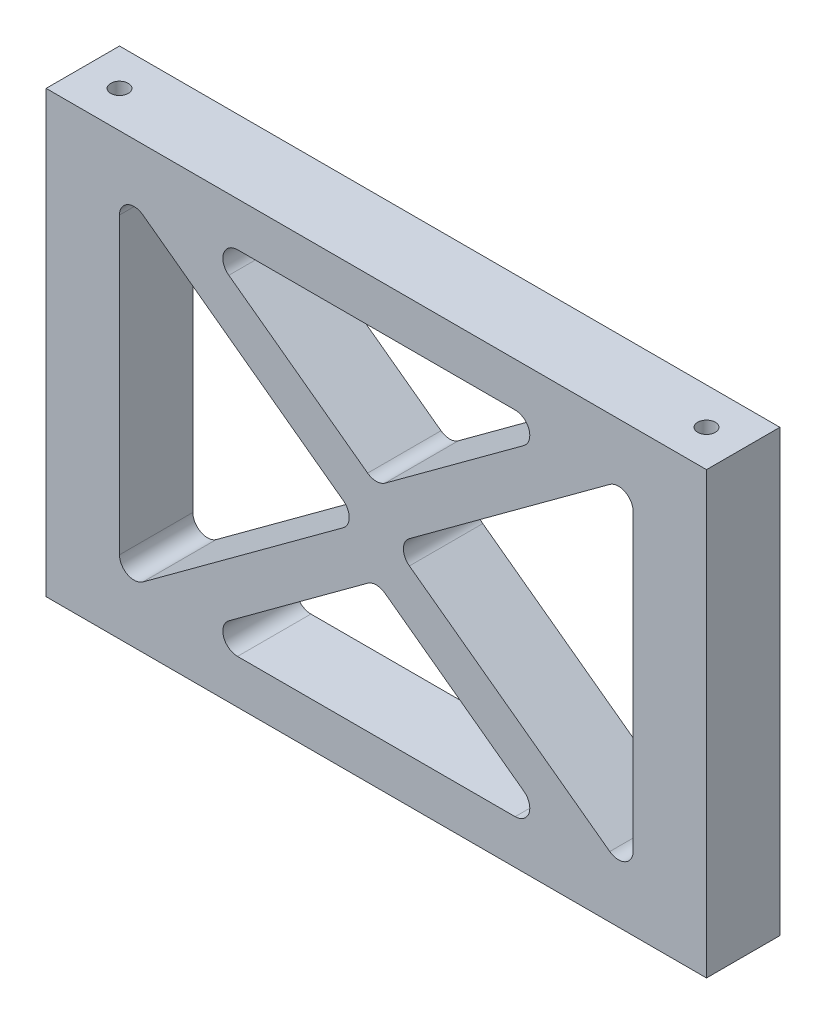
ISO-10303-21;
HEADER;
FILE_DESCRIPTION(('STEP AP214'),'2;1');
FILE_NAME('part.step','',(''),(''),'','','');
FILE_SCHEMA(('AUTOMOTIVE_DESIGN { 1 0 10303 214 1 1 1 1 }'));
ENDSEC;
DATA;
#1=APPLICATION_CONTEXT('core data for automotive mechanical design processes');
#2=APPLICATION_PROTOCOL_DEFINITION('international standard','automotive_design',2000,#1);
#3=PRODUCT_CONTEXT('',#1,'mechanical');
#4=PRODUCT('Part','Part','',(#3));
#5=PRODUCT_RELATED_PRODUCT_CATEGORY('part','',(#4));
#6=PRODUCT_DEFINITION_FORMATION('','',#4);
#7=PRODUCT_DEFINITION_CONTEXT('part definition',#1,'design');
#8=PRODUCT_DEFINITION('design','',#6,#7);
#9=PRODUCT_DEFINITION_SHAPE('','',#8);
#10=(LENGTH_UNIT() NAMED_UNIT(*) SI_UNIT(.MILLI.,.METRE.));
#11=(NAMED_UNIT(*) PLANE_ANGLE_UNIT() SI_UNIT($,.RADIAN.));
#12=(NAMED_UNIT(*) SI_UNIT($,.STERADIAN.) SOLID_ANGLE_UNIT());
#13=UNCERTAINTY_MEASURE_WITH_UNIT(LENGTH_MEASURE(1.E-05),#10,'distance_accuracy_value','');
#14=(GEOMETRIC_REPRESENTATION_CONTEXT(3) GLOBAL_UNCERTAINTY_ASSIGNED_CONTEXT((#13)) GLOBAL_UNIT_ASSIGNED_CONTEXT((#10,
#11,#12)) REPRESENTATION_CONTEXT('',''));
#15=CARTESIAN_POINT('',(0.,0.,0.));
#16=DIRECTION('',(0.,0.,1.));
#17=DIRECTION('',(1.,0.,0.));
#18=AXIS2_PLACEMENT_3D('',#15,#16,#17);
#19=CARTESIAN_POINT('',(0.,0.,10.));
#20=DIRECTION('',(1.,0.,0.));
#21=DIRECTION('',(0.,0.,-1.));
#22=AXIS2_PLACEMENT_3D('',#19,#20,#21);
#23=PLANE('',#22);
#24=DIRECTION('',(0.,-1.,0.));
#25=VECTOR('',#24,1.);
#26=CARTESIAN_POINT('',(0.,0.,0.));
#27=LINE('',#26,#25);
#28=CARTESIAN_POINT('',(0.,60.,0.));
#29=VERTEX_POINT('',#28);
#30=CARTESIAN_POINT('',(0.,0.,0.));
#31=VERTEX_POINT('',#30);
#32=EDGE_CURVE('E483',#29,#31,#27,.T.);
#33=ORIENTED_EDGE('',*,*,#32,.T.);
#34=DIRECTION('',(0.,0.,-1.));
#35=VECTOR('',#34,1.);
#36=CARTESIAN_POINT('',(0.,0.,10.));
#37=LINE('',#36,#35);
#38=CARTESIAN_POINT('',(0.,0.,10.));
#39=VERTEX_POINT('',#38);
#40=EDGE_CURVE('E11',#39,#31,#37,.T.);
#41=ORIENTED_EDGE('',*,*,#40,.F.);
#42=DIRECTION('',(0.,-1.,0.));
#43=VECTOR('',#42,1.);
#44=CARTESIAN_POINT('',(0.,0.,10.));
#45=LINE('',#44,#43);
#46=CARTESIAN_POINT('',(0.,60.,10.));
#47=VERTEX_POINT('',#46);
#48=EDGE_CURVE('E499',#47,#39,#45,.T.);
#49=ORIENTED_EDGE('',*,*,#48,.F.);
#50=DIRECTION('',(0.,0.,-1.));
#51=VECTOR('',#50,1.);
#52=CARTESIAN_POINT('',(0.,60.,10.));
#53=LINE('',#52,#51);
#54=EDGE_CURVE('E513',#47,#29,#53,.T.);
#55=ORIENTED_EDGE('',*,*,#54,.T.);
#56=EDGE_LOOP('',(#33,#41,#49,#55));
#57=FACE_BOUND('',#56,.T.);
#58=ADVANCED_FACE('F39',(#57),#23,.F.);
#59=CARTESIAN_POINT('',(0.,0.,10.));
#60=DIRECTION('',(0.,1.,0.));
#61=DIRECTION('',(0.,0.,1.));
#62=AXIS2_PLACEMENT_3D('',#59,#60,#61);
#63=PLANE('',#62);
#64=CARTESIAN_POINT('',(5.,0.,5.));
#65=DIRECTION('',(0.,1.,0.));
#66=DIRECTION('',(0.,0.,1.));
#67=AXIS2_PLACEMENT_3D('',#64,#65,#66);
#68=CIRCLE('',#67,1.2);
#69=CARTESIAN_POINT('',(5.,0.,6.2));
#70=VERTEX_POINT('',#69);
#71=EDGE_CURVE('E260',#70,#70,#68,.T.);
#72=ORIENTED_EDGE('',*,*,#71,.T.);
#73=EDGE_LOOP('',(#72));
#74=FACE_BOUND('',#73,.T.);
#75=CARTESIAN_POINT('',(85.,0.,5.));
#76=DIRECTION('',(0.,1.,0.));
#77=DIRECTION('',(0.,0.,1.));
#78=AXIS2_PLACEMENT_3D('',#75,#76,#77);
#79=CIRCLE('',#78,1.2);
#80=CARTESIAN_POINT('',(85.,0.,6.2));
#81=VERTEX_POINT('',#80);
#82=EDGE_CURVE('E677',#81,#81,#79,.T.);
#83=ORIENTED_EDGE('',*,*,#82,.T.);
#84=EDGE_LOOP('',(#83));
#85=FACE_BOUND('',#84,.T.);
#86=DIRECTION('',(1.,0.,0.));
#87=VECTOR('',#86,1.);
#88=CARTESIAN_POINT('',(0.,0.,0.));
#89=LINE('',#88,#87);
#90=CARTESIAN_POINT('',(90.,0.,0.));
#91=VERTEX_POINT('',#90);
#92=EDGE_CURVE('E517',#31,#91,#89,.T.);
#93=ORIENTED_EDGE('',*,*,#92,.T.);
#94=DIRECTION('',(0.,0.,-1.));
#95=VECTOR('',#94,1.);
#96=CARTESIAN_POINT('',(90.,0.,10.));
#97=LINE('',#96,#95);
#98=CARTESIAN_POINT('',(90.,0.,10.));
#99=VERTEX_POINT('',#98);
#100=EDGE_CURVE('E47',#99,#91,#97,.T.);
#101=ORIENTED_EDGE('',*,*,#100,.F.);
#102=DIRECTION('',(1.,0.,0.));
#103=VECTOR('',#102,1.);
#104=CARTESIAN_POINT('',(0.,0.,10.));
#105=LINE('',#104,#103);
#106=EDGE_CURVE('E503',#39,#99,#105,.T.);
#107=ORIENTED_EDGE('',*,*,#106,.F.);
#108=ORIENTED_EDGE('',*,*,#40,.T.);
#109=EDGE_LOOP('',(#93,#101,#107,#108));
#110=FACE_BOUND('',#109,.T.);
#111=ADVANCED_FACE('F552',(#74,#85,#110),#63,.F.);
#112=CARTESIAN_POINT('',(90.,0.,10.));
#113=DIRECTION('',(-1.,0.,0.));
#114=DIRECTION('',(0.,0.,1.));
#115=AXIS2_PLACEMENT_3D('',#112,#113,#114);
#116=PLANE('',#115);
#117=DIRECTION('',(0.,1.,0.));
#118=VECTOR('',#117,1.);
#119=CARTESIAN_POINT('',(90.,0.,0.));
#120=LINE('',#119,#118);
#121=CARTESIAN_POINT('',(90.,60.,0.));
#122=VERTEX_POINT('',#121);
#123=EDGE_CURVE('E520',#91,#122,#120,.T.);
#124=ORIENTED_EDGE('',*,*,#123,.T.);
#125=DIRECTION('',(0.,0.,-1.));
#126=VECTOR('',#125,1.);
#127=CARTESIAN_POINT('',(90.,60.,10.));
#128=LINE('',#127,#126);
#129=CARTESIAN_POINT('',(90.,60.,10.));
#130=VERTEX_POINT('',#129);
#131=EDGE_CURVE('E528',#130,#122,#128,.T.);
#132=ORIENTED_EDGE('',*,*,#131,.F.);
#133=DIRECTION('',(0.,1.,0.));
#134=VECTOR('',#133,1.);
#135=CARTESIAN_POINT('',(90.,0.,10.));
#136=LINE('',#135,#134);
#137=EDGE_CURVE('E507',#99,#130,#136,.T.);
#138=ORIENTED_EDGE('',*,*,#137,.F.);
#139=ORIENTED_EDGE('',*,*,#100,.T.);
#140=EDGE_LOOP('',(#124,#132,#138,#139));
#141=FACE_BOUND('',#140,.T.);
#142=ADVANCED_FACE('F537',(#141),#116,.F.);
#143=CARTESIAN_POINT('',(0.,60.,10.));
#144=DIRECTION('',(0.,-1.,0.));
#145=DIRECTION('',(0.,0.,-1.));
#146=AXIS2_PLACEMENT_3D('',#143,#144,#145);
#147=PLANE('',#146);
#148=CARTESIAN_POINT('',(5.,60.,5.));
#149=DIRECTION('',(0.,1.,0.));
#150=DIRECTION('',(0.,0.,1.));
#151=AXIS2_PLACEMENT_3D('',#148,#149,#150);
#152=CIRCLE('',#151,1.2);
#153=CARTESIAN_POINT('',(5.,60.,6.2));
#154=VERTEX_POINT('',#153);
#155=EDGE_CURVE('E674',#154,#154,#152,.T.);
#156=ORIENTED_EDGE('',*,*,#155,.F.);
#157=EDGE_LOOP('',(#156));
#158=FACE_BOUND('',#157,.T.);
#159=CARTESIAN_POINT('',(85.,60.,5.));
#160=DIRECTION('',(0.,1.,0.));
#161=DIRECTION('',(0.,0.,1.));
#162=AXIS2_PLACEMENT_3D('',#159,#160,#161);
#163=CIRCLE('',#162,1.2);
#164=CARTESIAN_POINT('',(85.,60.,6.2));
#165=VERTEX_POINT('',#164);
#166=EDGE_CURVE('E682',#165,#165,#163,.T.);
#167=ORIENTED_EDGE('',*,*,#166,.F.);
#168=EDGE_LOOP('',(#167));
#169=FACE_BOUND('',#168,.T.);
#170=DIRECTION('',(-1.,0.,0.));
#171=VECTOR('',#170,1.);
#172=CARTESIAN_POINT('',(0.,60.,0.));
#173=LINE('',#172,#171);
#174=EDGE_CURVE('E504',#122,#29,#173,.T.);
#175=ORIENTED_EDGE('',*,*,#174,.T.);
#176=ORIENTED_EDGE('',*,*,#54,.F.);
#177=DIRECTION('',(-1.,0.,0.));
#178=VECTOR('',#177,1.);
#179=CARTESIAN_POINT('',(0.,60.,10.));
#180=LINE('',#179,#178);
#181=EDGE_CURVE('E510',#130,#47,#180,.T.);
#182=ORIENTED_EDGE('',*,*,#181,.F.);
#183=ORIENTED_EDGE('',*,*,#131,.T.);
#184=EDGE_LOOP('',(#175,#176,#182,#183));
#185=FACE_BOUND('',#184,.T.);
#186=ADVANCED_FACE('F545',(#158,#169,#185),#147,.F.);
#187=CARTESIAN_POINT('',(0.,0.,10.));
#188=DIRECTION('',(0.,0.,-1.));
#189=DIRECTION('',(-1.,0.,0.));
#190=AXIS2_PLACEMENT_3D('',#187,#188,#189);
#191=PLANE('',#190);
#192=DIRECTION('',(-0.806061266223133,0.591832100426092,0.));
#193=VECTOR('',#192,1.);
#194=CARTESIAN_POINT('',(46.1836642008522,23.5006699268951,10.));
#195=LINE('',#194,#193);
#196=CARTESIAN_POINT('',(65.0995359332397,9.61212253244626,10.));
#197=VERTEX_POINT('',#196);
#198=CARTESIAN_POINT('',(46.1836642008522,23.5006699268951,10.));
#199=VERTEX_POINT('',#198);
#200=EDGE_CURVE('E332',#197,#199,#195,.T.);
#201=ORIENTED_EDGE('',*,*,#200,.F.);
#202=CARTESIAN_POINT('',(63.9158717323875,7.99999999999999,10.));
#203=DIRECTION('',(0.,0.,1.));
#204=DIRECTION('',(-1.,0.,0.));
#205=AXIS2_PLACEMENT_3D('',#202,#203,#204);
#206=CIRCLE('',#205,2.);
#207=CARTESIAN_POINT('',(63.9158717323875,6.,10.));
#208=VERTEX_POINT('',#207);
#209=EDGE_CURVE('E54',#208,#197,#206,.T.);
#210=ORIENTED_EDGE('',*,*,#209,.F.);
#211=DIRECTION('',(1.,0.,0.));
#212=VECTOR('',#211,1.);
#213=CARTESIAN_POINT('',(26.0841282676125,6.,10.));
#214=LINE('',#213,#212);
#215=CARTESIAN_POINT('',(26.0841282676125,5.99999999999999,10.));
#216=VERTEX_POINT('',#215);
#217=EDGE_CURVE('E309',#216,#208,#214,.T.);
#218=ORIENTED_EDGE('',*,*,#217,.F.);
#219=CARTESIAN_POINT('',(26.0841282676125,7.99999999999999,10.));
#220=DIRECTION('',(0.,0.,1.));
#221=DIRECTION('',(-1.,0.,0.));
#222=AXIS2_PLACEMENT_3D('',#219,#220,#221);
#223=CIRCLE('',#222,2.);
#224=CARTESIAN_POINT('',(24.9004640667603,9.61212253244626,10.));
#225=VERTEX_POINT('',#224);
#226=EDGE_CURVE('E345',#225,#216,#223,.T.);
#227=ORIENTED_EDGE('',*,*,#226,.F.);
#228=DIRECTION('',(-0.806061266223133,-0.591832100426092,0.));
#229=VECTOR('',#228,1.);
#230=CARTESIAN_POINT('',(43.8163357991478,23.5006699268951,10.));
#231=LINE('',#230,#229);
#232=CARTESIAN_POINT('',(43.8163357991478,23.5006699268951,10.));
#233=VERTEX_POINT('',#232);
#234=EDGE_CURVE('E341',#233,#225,#231,.T.);
#235=ORIENTED_EDGE('',*,*,#234,.F.);
#236=CARTESIAN_POINT('',(45.,21.8885473944488,10.));
#237=DIRECTION('',(0.,0.,1.));
#238=DIRECTION('',(-1.,0.,0.));
#239=AXIS2_PLACEMENT_3D('',#236,#237,#238);
#240=CIRCLE('',#239,2.);
#241=EDGE_CURVE('E337',#199,#233,#240,.T.);
#242=ORIENTED_EDGE('',*,*,#241,.F.);
#243=EDGE_LOOP('',(#201,#210,#218,#227,#235,#242));
#244=FACE_BOUND('',#243,.T.);
#245=DIRECTION('',(-1.,0.,0.));
#246=VECTOR('',#245,1.);
#247=CARTESIAN_POINT('',(26.0841282676125,54.,10.));
#248=LINE('',#247,#246);
#249=CARTESIAN_POINT('',(63.9158717323875,54.,10.));
#250=VERTEX_POINT('',#249);
#251=CARTESIAN_POINT('',(26.0841282676125,54.,10.));
#252=VERTEX_POINT('',#251);
#253=EDGE_CURVE('E398',#250,#252,#248,.T.);
#254=ORIENTED_EDGE('',*,*,#253,.F.);
#255=CARTESIAN_POINT('',(63.9158717323875,52.,10.));
#256=DIRECTION('',(0.,0.,1.));
#257=DIRECTION('',(1.,0.,0.));
#258=AXIS2_PLACEMENT_3D('',#255,#256,#257);
#259=CIRCLE('',#258,2.);
#260=CARTESIAN_POINT('',(65.0995359332397,50.3878774675537,10.));
#261=VERTEX_POINT('',#260);
#262=EDGE_CURVE('E62',#261,#250,#259,.T.);
#263=ORIENTED_EDGE('',*,*,#262,.F.);
#264=DIRECTION('',(0.806061266223133,0.591832100426092,0.));
#265=VECTOR('',#264,1.);
#266=CARTESIAN_POINT('',(46.1836642008522,36.4993300731049,10.));
#267=LINE('',#266,#265);
#268=CARTESIAN_POINT('',(46.1836642008522,36.4993300731049,10.));
#269=VERTEX_POINT('',#268);
#270=EDGE_CURVE('E375',#269,#261,#267,.T.);
#271=ORIENTED_EDGE('',*,*,#270,.F.);
#272=CARTESIAN_POINT('',(45.,38.1114526055512,10.));
#273=DIRECTION('',(0.,0.,1.));
#274=DIRECTION('',(1.,0.,0.));
#275=AXIS2_PLACEMENT_3D('',#272,#273,#274);
#276=CIRCLE('',#275,2.);
#277=CARTESIAN_POINT('',(43.8163357991478,36.4993300731049,10.));
#278=VERTEX_POINT('',#277);
#279=EDGE_CURVE('E410',#278,#269,#276,.T.);
#280=ORIENTED_EDGE('',*,*,#279,.F.);
#281=DIRECTION('',(0.806061266223133,-0.591832100426092,0.));
#282=VECTOR('',#281,1.);
#283=CARTESIAN_POINT('',(43.8163357991478,36.4993300731049,10.));
#284=LINE('',#283,#282);
#285=CARTESIAN_POINT('',(24.9004640667603,50.3878774675537,10.));
#286=VERTEX_POINT('',#285);
#287=EDGE_CURVE('E406',#286,#278,#284,.T.);
#288=ORIENTED_EDGE('',*,*,#287,.F.);
#289=CARTESIAN_POINT('',(26.0841282676125,52.,10.));
#290=DIRECTION('',(0.,0.,1.));
#291=DIRECTION('',(-1.,0.,0.));
#292=AXIS2_PLACEMENT_3D('',#289,#290,#291);
#293=CIRCLE('',#292,2.);
#294=EDGE_CURVE('E402',#252,#286,#293,.T.);
#295=ORIENTED_EDGE('',*,*,#294,.F.);
#296=EDGE_LOOP('',(#254,#263,#271,#280,#288,#295));
#297=FACE_BOUND('',#296,.T.);
#298=DIRECTION('',(-0.80606126622313,0.591832100426096,0.));
#299=VECTOR('',#298,1.);
#300=CARTESIAN_POINT('',(13.1836642008522,51.6624671721663,10.));
#301=LINE('',#300,#299);
#302=CARTESIAN_POINT('',(40.4917574537647,31.6121225324463,10.));
#303=VERTEX_POINT('',#302);
#304=CARTESIAN_POINT('',(13.1836642008522,51.6624671721663,10.));
#305=VERTEX_POINT('',#304);
#306=EDGE_CURVE('E276',#303,#305,#301,.T.);
#307=ORIENTED_EDGE('',*,*,#306,.F.);
#308=CARTESIAN_POINT('',(39.3080932529125,30.,10.));
#309=DIRECTION('',(0.,0.,1.));
#310=DIRECTION('',(-1.,0.,0.));
#311=AXIS2_PLACEMENT_3D('',#308,#309,#310);
#312=CIRCLE('',#311,2.);
#313=CARTESIAN_POINT('',(40.4917574537647,28.3878774675537,10.));
#314=VERTEX_POINT('',#313);
#315=EDGE_CURVE('E231',#314,#303,#312,.T.);
#316=ORIENTED_EDGE('',*,*,#315,.F.);
#317=DIRECTION('',(0.80606126622313,0.591832100426096,0.));
#318=VECTOR('',#317,1.);
#319=CARTESIAN_POINT('',(13.1836642008522,8.33753282783365,10.));
#320=LINE('',#319,#318);
#321=CARTESIAN_POINT('',(13.1836642008522,8.33753282783364,10.));
#322=VERTEX_POINT('',#321);
#323=EDGE_CURVE('E253',#322,#314,#320,.T.);
#324=ORIENTED_EDGE('',*,*,#323,.F.);
#325=CARTESIAN_POINT('',(12.,9.94965536027989,10.));
#326=DIRECTION('',(0.,0.,1.));
#327=DIRECTION('',(-1.,0.,0.));
#328=AXIS2_PLACEMENT_3D('',#325,#326,#327);
#329=CIRCLE('',#328,1.99999999999999);
#330=CARTESIAN_POINT('',(10.,9.94965536027989,10.));
#331=VERTEX_POINT('',#330);
#332=EDGE_CURVE('E257',#331,#322,#329,.T.);
#333=ORIENTED_EDGE('',*,*,#332,.F.);
#334=DIRECTION('',(0.,-1.,0.));
#335=VECTOR('',#334,1.);
#336=CARTESIAN_POINT('',(10.,50.0503446397201,10.));
#337=LINE('',#336,#335);
#338=CARTESIAN_POINT('',(10.,50.0503446397201,10.));
#339=VERTEX_POINT('',#338);
#340=EDGE_CURVE('E283',#339,#331,#337,.T.);
#341=ORIENTED_EDGE('',*,*,#340,.F.);
#342=CARTESIAN_POINT('',(12.,50.0503446397201,10.));
#343=DIRECTION('',(0.,0.,1.));
#344=DIRECTION('',(-1.,0.,0.));
#345=AXIS2_PLACEMENT_3D('',#342,#343,#344);
#346=CIRCLE('',#345,1.99999999999999);
#347=EDGE_CURVE('E279',#305,#339,#346,.T.);
#348=ORIENTED_EDGE('',*,*,#347,.F.);
#349=EDGE_LOOP('',(#307,#316,#324,#333,#341,#348));
#350=FACE_BOUND('',#349,.T.);
#351=DIRECTION('',(0.,1.,0.));
#352=VECTOR('',#351,1.);
#353=CARTESIAN_POINT('',(80.,50.0503446397201,10.));
#354=LINE('',#353,#352);
#355=CARTESIAN_POINT('',(80.,9.94965536027992,10.));
#356=VERTEX_POINT('',#355);
#357=CARTESIAN_POINT('',(80.,50.0503446397201,10.));
#358=VERTEX_POINT('',#357);
#359=EDGE_CURVE('E461',#356,#358,#354,.T.);
#360=ORIENTED_EDGE('',*,*,#359,.F.);
#361=CARTESIAN_POINT('',(78.,9.94965536027992,10.));
#362=DIRECTION('',(0.,0.,1.));
#363=DIRECTION('',(-1.,0.,0.));
#364=AXIS2_PLACEMENT_3D('',#361,#362,#363);
#365=CIRCLE('',#364,2.00000000000001);
#366=CARTESIAN_POINT('',(76.8163357991478,8.33753282783363,10.));
#367=VERTEX_POINT('',#366);
#368=EDGE_CURVE('E355',#367,#356,#365,.T.);
#369=ORIENTED_EDGE('',*,*,#368,.F.);
#370=DIRECTION('',(0.80606126622313,-0.591832100426096,0.));
#371=VECTOR('',#370,1.);
#372=CARTESIAN_POINT('',(76.8163357991478,8.33753282783363,10.));
#373=LINE('',#372,#371);
#374=CARTESIAN_POINT('',(49.5082425462353,28.3878774675537,10.));
#375=VERTEX_POINT('',#374);
#376=EDGE_CURVE('E438',#375,#367,#373,.T.);
#377=ORIENTED_EDGE('',*,*,#376,.F.);
#378=CARTESIAN_POINT('',(50.6919067470874,30.,10.));
#379=DIRECTION('',(0.,0.,1.));
#380=DIRECTION('',(-1.,0.,0.));
#381=AXIS2_PLACEMENT_3D('',#378,#379,#380);
#382=CIRCLE('',#381,2.);
#383=CARTESIAN_POINT('',(49.5082425462353,31.6121225324463,10.));
#384=VERTEX_POINT('',#383);
#385=EDGE_CURVE('E473',#384,#375,#382,.T.);
#386=ORIENTED_EDGE('',*,*,#385,.F.);
#387=DIRECTION('',(-0.80606126622313,-0.591832100426096,0.));
#388=VECTOR('',#387,1.);
#389=CARTESIAN_POINT('',(76.8163357991478,51.6624671721664,10.));
#390=LINE('',#389,#388);
#391=CARTESIAN_POINT('',(76.8163357991478,51.6624671721663,10.));
#392=VERTEX_POINT('',#391);
#393=EDGE_CURVE('E469',#392,#384,#390,.T.);
#394=ORIENTED_EDGE('',*,*,#393,.F.);
#395=CARTESIAN_POINT('',(78.,50.0503446397201,10.));
#396=DIRECTION('',(0.,0.,1.));
#397=DIRECTION('',(1.,0.,0.));
#398=AXIS2_PLACEMENT_3D('',#395,#396,#397);
#399=CIRCLE('',#398,2.00000000000001);
#400=EDGE_CURVE('E465',#358,#392,#399,.T.);
#401=ORIENTED_EDGE('',*,*,#400,.F.);
#402=EDGE_LOOP('',(#360,#369,#377,#386,#394,#401));
#403=FACE_BOUND('',#402,.T.);
#404=ORIENTED_EDGE('',*,*,#48,.T.);
#405=ORIENTED_EDGE('',*,*,#106,.T.);
#406=ORIENTED_EDGE('',*,*,#137,.T.);
#407=ORIENTED_EDGE('',*,*,#181,.T.);
#408=EDGE_LOOP('',(#404,#405,#406,#407));
#409=FACE_BOUND('',#408,.T.);
#410=ADVANCED_FACE('F551',(#244,#297,#350,#403,#409),#191,.F.);
#411=CARTESIAN_POINT('',(0.,0.,0.));
#412=DIRECTION('',(0.,0.,-1.));
#413=DIRECTION('',(-1.,0.,0.));
#414=AXIS2_PLACEMENT_3D('',#411,#412,#413);
#415=PLANE('',#414);
#416=CARTESIAN_POINT('',(63.9158717323875,7.99999999999999,0.));
#417=DIRECTION('',(0.,0.,1.));
#418=DIRECTION('',(-1.,0.,0.));
#419=AXIS2_PLACEMENT_3D('',#416,#417,#418);
#420=CIRCLE('',#419,2.);
#421=CARTESIAN_POINT('',(63.9158717323875,6.,0.));
#422=VERTEX_POINT('',#421);
#423=CARTESIAN_POINT('',(65.0995359332397,9.61212253244626,0.));
#424=VERTEX_POINT('',#423);
#425=EDGE_CURVE('E304',#422,#424,#420,.T.);
#426=ORIENTED_EDGE('',*,*,#425,.T.);
#427=DIRECTION('',(-0.806061266223133,0.591832100426092,0.));
#428=VECTOR('',#427,1.);
#429=CARTESIAN_POINT('',(46.1836642008522,23.5006699268951,0.));
#430=LINE('',#429,#428);
#431=CARTESIAN_POINT('',(46.1836642008522,23.5006699268951,0.));
#432=VERTEX_POINT('',#431);
#433=EDGE_CURVE('E308',#424,#432,#430,.T.);
#434=ORIENTED_EDGE('',*,*,#433,.T.);
#435=CARTESIAN_POINT('',(45.,21.8885473944488,0.));
#436=DIRECTION('',(0.,0.,1.));
#437=DIRECTION('',(-1.,0.,0.));
#438=AXIS2_PLACEMENT_3D('',#435,#436,#437);
#439=CIRCLE('',#438,2.);
#440=CARTESIAN_POINT('',(43.8163357991478,23.5006699268951,0.));
#441=VERTEX_POINT('',#440);
#442=EDGE_CURVE('E313',#432,#441,#439,.T.);
#443=ORIENTED_EDGE('',*,*,#442,.T.);
#444=DIRECTION('',(-0.806061266223133,-0.591832100426092,0.));
#445=VECTOR('',#444,1.);
#446=CARTESIAN_POINT('',(43.8163357991478,23.5006699268951,0.));
#447=LINE('',#446,#445);
#448=CARTESIAN_POINT('',(24.9004640667603,9.61212253244626,0.));
#449=VERTEX_POINT('',#448);
#450=EDGE_CURVE('E317',#441,#449,#447,.T.);
#451=ORIENTED_EDGE('',*,*,#450,.T.);
#452=CARTESIAN_POINT('',(26.0841282676125,7.99999999999999,0.));
#453=DIRECTION('',(0.,0.,1.));
#454=DIRECTION('',(-1.,0.,0.));
#455=AXIS2_PLACEMENT_3D('',#452,#453,#454);
#456=CIRCLE('',#455,2.);
#457=CARTESIAN_POINT('',(26.0841282676125,5.99999999999999,0.));
#458=VERTEX_POINT('',#457);
#459=EDGE_CURVE('E321',#449,#458,#456,.T.);
#460=ORIENTED_EDGE('',*,*,#459,.T.);
#461=DIRECTION('',(1.,0.,0.));
#462=VECTOR('',#461,1.);
#463=CARTESIAN_POINT('',(26.0841282676125,6.,0.));
#464=LINE('',#463,#462);
#465=EDGE_CURVE('E325',#458,#422,#464,.T.);
#466=ORIENTED_EDGE('',*,*,#465,.T.);
#467=EDGE_LOOP('',(#426,#434,#443,#451,#460,#466));
#468=FACE_BOUND('',#467,.T.);
#469=CARTESIAN_POINT('',(63.9158717323875,52.,0.));
#470=DIRECTION('',(0.,0.,1.));
#471=DIRECTION('',(1.,0.,0.));
#472=AXIS2_PLACEMENT_3D('',#469,#470,#471);
#473=CIRCLE('',#472,2.);
#474=CARTESIAN_POINT('',(65.0995359332397,50.3878774675537,0.));
#475=VERTEX_POINT('',#474);
#476=CARTESIAN_POINT('',(63.9158717323875,54.,0.));
#477=VERTEX_POINT('',#476);
#478=EDGE_CURVE('E370',#475,#477,#473,.T.);
#479=ORIENTED_EDGE('',*,*,#478,.T.);
#480=DIRECTION('',(-1.,0.,0.));
#481=VECTOR('',#480,1.);
#482=CARTESIAN_POINT('',(26.0841282676125,54.,0.));
#483=LINE('',#482,#481);
#484=CARTESIAN_POINT('',(26.0841282676125,54.,0.));
#485=VERTEX_POINT('',#484);
#486=EDGE_CURVE('E374',#477,#485,#483,.T.);
#487=ORIENTED_EDGE('',*,*,#486,.T.);
#488=CARTESIAN_POINT('',(26.0841282676125,52.,0.));
#489=DIRECTION('',(0.,0.,1.));
#490=DIRECTION('',(-1.,0.,0.));
#491=AXIS2_PLACEMENT_3D('',#488,#489,#490);
#492=CIRCLE('',#491,2.);
#493=CARTESIAN_POINT('',(24.9004640667603,50.3878774675537,0.));
#494=VERTEX_POINT('',#493);
#495=EDGE_CURVE('E379',#485,#494,#492,.T.);
#496=ORIENTED_EDGE('',*,*,#495,.T.);
#497=DIRECTION('',(0.806061266223133,-0.591832100426092,0.));
#498=VECTOR('',#497,1.);
#499=CARTESIAN_POINT('',(43.8163357991478,36.4993300731049,0.));
#500=LINE('',#499,#498);
#501=CARTESIAN_POINT('',(43.8163357991478,36.4993300731049,0.));
#502=VERTEX_POINT('',#501);
#503=EDGE_CURVE('E383',#494,#502,#500,.T.);
#504=ORIENTED_EDGE('',*,*,#503,.T.);
#505=CARTESIAN_POINT('',(45.,38.1114526055512,0.));
#506=DIRECTION('',(0.,0.,1.));
#507=DIRECTION('',(1.,0.,0.));
#508=AXIS2_PLACEMENT_3D('',#505,#506,#507);
#509=CIRCLE('',#508,2.);
#510=CARTESIAN_POINT('',(46.1836642008522,36.4993300731049,0.));
#511=VERTEX_POINT('',#510);
#512=EDGE_CURVE('E387',#502,#511,#509,.T.);
#513=ORIENTED_EDGE('',*,*,#512,.T.);
#514=DIRECTION('',(0.806061266223133,0.591832100426092,0.));
#515=VECTOR('',#514,1.);
#516=CARTESIAN_POINT('',(46.1836642008522,36.4993300731049,0.));
#517=LINE('',#516,#515);
#518=EDGE_CURVE('E391',#511,#475,#517,.T.);
#519=ORIENTED_EDGE('',*,*,#518,.T.);
#520=EDGE_LOOP('',(#479,#487,#496,#504,#513,#519));
#521=FACE_BOUND('',#520,.T.);
#522=CARTESIAN_POINT('',(39.3080932529125,30.,0.));
#523=DIRECTION('',(0.,0.,1.));
#524=DIRECTION('',(-1.,0.,0.));
#525=AXIS2_PLACEMENT_3D('',#522,#523,#524);
#526=CIRCLE('',#525,2.);
#527=CARTESIAN_POINT('',(40.4917574537647,28.3878774675537,0.));
#528=VERTEX_POINT('',#527);
#529=CARTESIAN_POINT('',(40.4917574537647,31.6121225324463,0.));
#530=VERTEX_POINT('',#529);
#531=EDGE_CURVE('E228',#528,#530,#526,.T.);
#532=ORIENTED_EDGE('',*,*,#531,.T.);
#533=DIRECTION('',(-0.80606126622313,0.591832100426096,0.));
#534=VECTOR('',#533,1.);
#535=CARTESIAN_POINT('',(13.1836642008522,51.6624671721663,0.));
#536=LINE('',#535,#534);
#537=CARTESIAN_POINT('',(13.1836642008522,51.6624671721663,0.));
#538=VERTEX_POINT('',#537);
#539=EDGE_CURVE('E241',#530,#538,#536,.T.);
#540=ORIENTED_EDGE('',*,*,#539,.T.);
#541=CARTESIAN_POINT('',(12.,50.0503446397201,0.));
#542=DIRECTION('',(0.,0.,1.));
#543=DIRECTION('',(-1.,0.,0.));
#544=AXIS2_PLACEMENT_3D('',#541,#542,#543);
#545=CIRCLE('',#544,1.99999999999999);
#546=CARTESIAN_POINT('',(10.,50.0503446397201,0.));
#547=VERTEX_POINT('',#546);
#548=EDGE_CURVE('E246',#538,#547,#545,.T.);
#549=ORIENTED_EDGE('',*,*,#548,.T.);
#550=DIRECTION('',(0.,-1.,0.));
#551=VECTOR('',#550,1.);
#552=CARTESIAN_POINT('',(10.,50.0503446397201,0.));
#553=LINE('',#552,#551);
#554=CARTESIAN_POINT('',(10.,9.94965536027989,0.));
#555=VERTEX_POINT('',#554);
#556=EDGE_CURVE('E265',#547,#555,#553,.T.);
#557=ORIENTED_EDGE('',*,*,#556,.T.);
#558=CARTESIAN_POINT('',(12.,9.94965536027989,0.));
#559=DIRECTION('',(0.,0.,1.));
#560=DIRECTION('',(-1.,0.,0.));
#561=AXIS2_PLACEMENT_3D('',#558,#559,#560);
#562=CIRCLE('',#561,1.99999999999999);
#563=CARTESIAN_POINT('',(13.1836642008522,8.33753282783364,0.));
#564=VERTEX_POINT('',#563);
#565=EDGE_CURVE('E269',#555,#564,#562,.T.);
#566=ORIENTED_EDGE('',*,*,#565,.T.);
#567=DIRECTION('',(0.80606126622313,0.591832100426096,0.));
#568=VECTOR('',#567,1.);
#569=CARTESIAN_POINT('',(13.1836642008522,8.33753282783365,0.));
#570=LINE('',#569,#568);
#571=EDGE_CURVE('E237',#564,#528,#570,.T.);
#572=ORIENTED_EDGE('',*,*,#571,.T.);
#573=EDGE_LOOP('',(#532,#540,#549,#557,#566,#572));
#574=FACE_BOUND('',#573,.T.);
#575=CARTESIAN_POINT('',(78.,9.94965536027992,0.));
#576=DIRECTION('',(0.,0.,1.));
#577=DIRECTION('',(-1.,0.,0.));
#578=AXIS2_PLACEMENT_3D('',#575,#576,#577);
#579=CIRCLE('',#578,2.00000000000001);
#580=CARTESIAN_POINT('',(76.8163357991478,8.33753282783363,0.));
#581=VERTEX_POINT('',#580);
#582=CARTESIAN_POINT('',(80.,9.94965536027992,0.));
#583=VERTEX_POINT('',#582);
#584=EDGE_CURVE('E433',#581,#583,#579,.T.);
#585=ORIENTED_EDGE('',*,*,#584,.T.);
#586=DIRECTION('',(0.,1.,0.));
#587=VECTOR('',#586,1.);
#588=CARTESIAN_POINT('',(80.,50.0503446397201,0.));
#589=LINE('',#588,#587);
#590=CARTESIAN_POINT('',(80.,50.0503446397201,0.));
#591=VERTEX_POINT('',#590);
#592=EDGE_CURVE('E437',#583,#591,#589,.T.);
#593=ORIENTED_EDGE('',*,*,#592,.T.);
#594=CARTESIAN_POINT('',(78.,50.0503446397201,0.));
#595=DIRECTION('',(0.,0.,1.));
#596=DIRECTION('',(1.,0.,0.));
#597=AXIS2_PLACEMENT_3D('',#594,#595,#596);
#598=CIRCLE('',#597,2.00000000000001);
#599=CARTESIAN_POINT('',(76.8163357991478,51.6624671721663,0.));
#600=VERTEX_POINT('',#599);
#601=EDGE_CURVE('E442',#591,#600,#598,.T.);
#602=ORIENTED_EDGE('',*,*,#601,.T.);
#603=DIRECTION('',(-0.80606126622313,-0.591832100426096,0.));
#604=VECTOR('',#603,1.);
#605=CARTESIAN_POINT('',(76.8163357991478,51.6624671721664,0.));
#606=LINE('',#605,#604);
#607=CARTESIAN_POINT('',(49.5082425462353,31.6121225324463,0.));
#608=VERTEX_POINT('',#607);
#609=EDGE_CURVE('E446',#600,#608,#606,.T.);
#610=ORIENTED_EDGE('',*,*,#609,.T.);
#611=CARTESIAN_POINT('',(50.6919067470874,30.,0.));
#612=DIRECTION('',(0.,0.,1.));
#613=DIRECTION('',(-1.,0.,0.));
#614=AXIS2_PLACEMENT_3D('',#611,#612,#613);
#615=CIRCLE('',#614,2.);
#616=CARTESIAN_POINT('',(49.5082425462353,28.3878774675537,0.));
#617=VERTEX_POINT('',#616);
#618=EDGE_CURVE('E450',#608,#617,#615,.T.);
#619=ORIENTED_EDGE('',*,*,#618,.T.);
#620=DIRECTION('',(0.80606126622313,-0.591832100426096,0.));
#621=VECTOR('',#620,1.);
#622=CARTESIAN_POINT('',(76.8163357991478,8.33753282783363,0.));
#623=LINE('',#622,#621);
#624=EDGE_CURVE('E454',#617,#581,#623,.T.);
#625=ORIENTED_EDGE('',*,*,#624,.T.);
#626=EDGE_LOOP('',(#585,#593,#602,#610,#619,#625));
#627=FACE_BOUND('',#626,.T.);
#628=ORIENTED_EDGE('',*,*,#32,.F.);
#629=ORIENTED_EDGE('',*,*,#174,.F.);
#630=ORIENTED_EDGE('',*,*,#123,.F.);
#631=ORIENTED_EDGE('',*,*,#92,.F.);
#632=EDGE_LOOP('',(#628,#629,#630,#631));
#633=FACE_BOUND('',#632,.T.);
#634=ADVANCED_FACE('F248',(#468,#521,#574,#627,#633),#415,.T.);
#635=CARTESIAN_POINT('',(78.,9.94965536027992,0.));
#636=DIRECTION('',(0.,0.,1.));
#637=DIRECTION('',(1.,0.,0.));
#638=AXIS2_PLACEMENT_3D('',#635,#636,#637);
#639=CYLINDRICAL_SURFACE('',#638,2.00000000000001);
#640=ORIENTED_EDGE('',*,*,#368,.T.);
#641=DIRECTION('',(0.,0.,1.));
#642=VECTOR('',#641,1.);
#643=CARTESIAN_POINT('',(80.,9.94965536027992,0.));
#644=LINE('',#643,#642);
#645=EDGE_CURVE('E458',#583,#356,#644,.T.);
#646=ORIENTED_EDGE('',*,*,#645,.F.);
#647=ORIENTED_EDGE('',*,*,#584,.F.);
#648=DIRECTION('',(0.,0.,1.));
#649=VECTOR('',#648,1.);
#650=CARTESIAN_POINT('',(76.8163357991478,8.33753282783363,0.));
#651=LINE('',#650,#649);
#652=EDGE_CURVE('E480',#581,#367,#651,.T.);
#653=ORIENTED_EDGE('',*,*,#652,.T.);
#654=EDGE_LOOP('',(#640,#646,#647,#653));
#655=FACE_BOUND('',#654,.T.);
#656=ADVANCED_FACE('F568',(#655),#639,.F.);
#657=CARTESIAN_POINT('',(76.8163357991478,8.33753282783363,0.));
#658=DIRECTION('',(-0.591832100426096,-0.80606126622313,0.));
#659=DIRECTION('',(0.80606126622313,-0.591832100426096,0.));
#660=AXIS2_PLACEMENT_3D('',#657,#658,#659);
#661=PLANE('',#660);
#662=ORIENTED_EDGE('',*,*,#376,.T.);
#663=ORIENTED_EDGE('',*,*,#652,.F.);
#664=ORIENTED_EDGE('',*,*,#624,.F.);
#665=DIRECTION('',(0.,0.,1.));
#666=VECTOR('',#665,1.);
#667=CARTESIAN_POINT('',(49.5082425462353,28.3878774675537,0.));
#668=LINE('',#667,#666);
#669=EDGE_CURVE('E484',#617,#375,#668,.T.);
#670=ORIENTED_EDGE('',*,*,#669,.T.);
#671=EDGE_LOOP('',(#662,#663,#664,#670));
#672=FACE_BOUND('',#671,.T.);
#673=ADVANCED_FACE('F575',(#672),#661,.F.);
#674=CARTESIAN_POINT('',(50.6919067470874,30.,0.));
#675=DIRECTION('',(0.,0.,1.));
#676=DIRECTION('',(1.,0.,0.));
#677=AXIS2_PLACEMENT_3D('',#674,#675,#676);
#678=CYLINDRICAL_SURFACE('',#677,2.);
#679=ORIENTED_EDGE('',*,*,#385,.T.);
#680=ORIENTED_EDGE('',*,*,#669,.F.);
#681=ORIENTED_EDGE('',*,*,#618,.F.);
#682=DIRECTION('',(0.,0.,1.));
#683=VECTOR('',#682,1.);
#684=CARTESIAN_POINT('',(49.5082425462353,31.6121225324463,0.));
#685=LINE('',#684,#683);
#686=EDGE_CURVE('E487',#608,#384,#685,.T.);
#687=ORIENTED_EDGE('',*,*,#686,.T.);
#688=EDGE_LOOP('',(#679,#680,#681,#687));
#689=FACE_BOUND('',#688,.T.);
#690=ADVANCED_FACE('F588',(#689),#678,.F.);
#691=CARTESIAN_POINT('',(76.8163357991478,51.6624671721664,0.));
#692=DIRECTION('',(-0.591832100426096,0.80606126622313,0.));
#693=DIRECTION('',(-0.80606126622313,-0.591832100426096,0.));
#694=AXIS2_PLACEMENT_3D('',#691,#692,#693);
#695=PLANE('',#694);
#696=ORIENTED_EDGE('',*,*,#393,.T.);
#697=ORIENTED_EDGE('',*,*,#686,.F.);
#698=ORIENTED_EDGE('',*,*,#609,.F.);
#699=DIRECTION('',(0.,0.,1.));
#700=VECTOR('',#699,1.);
#701=CARTESIAN_POINT('',(76.8163357991478,51.6624671721663,0.));
#702=LINE('',#701,#700);
#703=EDGE_CURVE('E490',#600,#392,#702,.T.);
#704=ORIENTED_EDGE('',*,*,#703,.T.);
#705=EDGE_LOOP('',(#696,#697,#698,#704));
#706=FACE_BOUND('',#705,.T.);
#707=ADVANCED_FACE('F584',(#706),#695,.F.);
#708=CARTESIAN_POINT('',(78.,50.0503446397201,0.));
#709=DIRECTION('',(0.,0.,1.));
#710=DIRECTION('',(1.,0.,0.));
#711=AXIS2_PLACEMENT_3D('',#708,#709,#710);
#712=CYLINDRICAL_SURFACE('',#711,2.00000000000001);
#713=ORIENTED_EDGE('',*,*,#400,.T.);
#714=ORIENTED_EDGE('',*,*,#703,.F.);
#715=ORIENTED_EDGE('',*,*,#601,.F.);
#716=DIRECTION('',(0.,0.,1.));
#717=VECTOR('',#716,1.);
#718=CARTESIAN_POINT('',(80.,50.0503446397201,0.));
#719=LINE('',#718,#717);
#720=EDGE_CURVE('E493',#591,#358,#719,.T.);
#721=ORIENTED_EDGE('',*,*,#720,.T.);
#722=EDGE_LOOP('',(#713,#714,#715,#721));
#723=FACE_BOUND('',#722,.T.);
#724=ADVANCED_FACE('F580',(#723),#712,.F.);
#725=CARTESIAN_POINT('',(80.,50.0503446397201,0.));
#726=DIRECTION('',(1.,0.,0.));
#727=DIRECTION('',(0.,0.,-1.));
#728=AXIS2_PLACEMENT_3D('',#725,#726,#727);
#729=PLANE('',#728);
#730=ORIENTED_EDGE('',*,*,#359,.T.);
#731=ORIENTED_EDGE('',*,*,#720,.F.);
#732=ORIENTED_EDGE('',*,*,#592,.F.);
#733=ORIENTED_EDGE('',*,*,#645,.T.);
#734=EDGE_LOOP('',(#730,#731,#732,#733));
#735=FACE_BOUND('',#734,.T.);
#736=ADVANCED_FACE('F577',(#735),#729,.F.);
#737=CARTESIAN_POINT('',(39.3080932529125,30.,0.));
#738=DIRECTION('',(0.,0.,1.));
#739=DIRECTION('',(1.,0.,0.));
#740=AXIS2_PLACEMENT_3D('',#737,#738,#739);
#741=CYLINDRICAL_SURFACE('',#740,2.);
#742=ORIENTED_EDGE('',*,*,#315,.T.);
#743=DIRECTION('',(0.,0.,1.));
#744=VECTOR('',#743,1.);
#745=CARTESIAN_POINT('',(40.4917574537647,31.6121225324463,0.));
#746=LINE('',#745,#744);
#747=EDGE_CURVE('E224',#530,#303,#746,.T.);
#748=ORIENTED_EDGE('',*,*,#747,.F.);
#749=ORIENTED_EDGE('',*,*,#531,.F.);
#750=DIRECTION('',(0.,0.,1.));
#751=VECTOR('',#750,1.);
#752=CARTESIAN_POINT('',(40.4917574537647,28.3878774675537,0.));
#753=LINE('',#752,#751);
#754=EDGE_CURVE('E290',#528,#314,#753,.T.);
#755=ORIENTED_EDGE('',*,*,#754,.T.);
#756=EDGE_LOOP('',(#742,#748,#749,#755));
#757=FACE_BOUND('',#756,.T.);
#758=ADVANCED_FACE('F226',(#757),#741,.F.);
#759=CARTESIAN_POINT('',(13.1836642008522,8.33753282783365,0.));
#760=DIRECTION('',(0.591832100426096,-0.80606126622313,0.));
#761=DIRECTION('',(0.80606126622313,0.591832100426096,0.));
#762=AXIS2_PLACEMENT_3D('',#759,#760,#761);
#763=PLANE('',#762);
#764=ORIENTED_EDGE('',*,*,#323,.T.);
#765=ORIENTED_EDGE('',*,*,#754,.F.);
#766=ORIENTED_EDGE('',*,*,#571,.F.);
#767=DIRECTION('',(0.,0.,1.));
#768=VECTOR('',#767,1.);
#769=CARTESIAN_POINT('',(13.1836642008522,8.33753282783364,0.));
#770=LINE('',#769,#768);
#771=EDGE_CURVE('E293',#564,#322,#770,.T.);
#772=ORIENTED_EDGE('',*,*,#771,.T.);
#773=EDGE_LOOP('',(#764,#765,#766,#772));
#774=FACE_BOUND('',#773,.T.);
#775=ADVANCED_FACE('F645',(#774),#763,.F.);
#776=CARTESIAN_POINT('',(12.,9.94965536027989,0.));
#777=DIRECTION('',(0.,0.,1.));
#778=DIRECTION('',(1.,0.,0.));
#779=AXIS2_PLACEMENT_3D('',#776,#777,#778);
#780=CYLINDRICAL_SURFACE('',#779,1.99999999999999);
#781=ORIENTED_EDGE('',*,*,#332,.T.);
#782=ORIENTED_EDGE('',*,*,#771,.F.);
#783=ORIENTED_EDGE('',*,*,#565,.F.);
#784=DIRECTION('',(0.,0.,1.));
#785=VECTOR('',#784,1.);
#786=CARTESIAN_POINT('',(10.,9.94965536027989,0.));
#787=LINE('',#786,#785);
#788=EDGE_CURVE('E296',#555,#331,#787,.T.);
#789=ORIENTED_EDGE('',*,*,#788,.T.);
#790=EDGE_LOOP('',(#781,#782,#783,#789));
#791=FACE_BOUND('',#790,.T.);
#792=ADVANCED_FACE('F655',(#791),#780,.F.);
#793=CARTESIAN_POINT('',(10.,50.0503446397201,0.));
#794=DIRECTION('',(-1.,0.,0.));
#795=DIRECTION('',(0.,0.,1.));
#796=AXIS2_PLACEMENT_3D('',#793,#794,#795);
#797=PLANE('',#796);
#798=ORIENTED_EDGE('',*,*,#340,.T.);
#799=ORIENTED_EDGE('',*,*,#788,.F.);
#800=ORIENTED_EDGE('',*,*,#556,.F.);
#801=DIRECTION('',(0.,0.,1.));
#802=VECTOR('',#801,1.);
#803=CARTESIAN_POINT('',(10.,50.0503446397201,0.));
#804=LINE('',#803,#802);
#805=EDGE_CURVE('E299',#547,#339,#804,.T.);
#806=ORIENTED_EDGE('',*,*,#805,.T.);
#807=EDGE_LOOP('',(#798,#799,#800,#806));
#808=FACE_BOUND('',#807,.T.);
#809=ADVANCED_FACE('F651',(#808),#797,.F.);
#810=CARTESIAN_POINT('',(12.,50.0503446397201,0.));
#811=DIRECTION('',(0.,0.,1.));
#812=DIRECTION('',(1.,0.,0.));
#813=AXIS2_PLACEMENT_3D('',#810,#811,#812);
#814=CYLINDRICAL_SURFACE('',#813,1.99999999999999);
#815=ORIENTED_EDGE('',*,*,#347,.T.);
#816=ORIENTED_EDGE('',*,*,#805,.F.);
#817=ORIENTED_EDGE('',*,*,#548,.F.);
#818=DIRECTION('',(0.,0.,1.));
#819=VECTOR('',#818,1.);
#820=CARTESIAN_POINT('',(13.1836642008522,51.6624671721663,0.));
#821=LINE('',#820,#819);
#822=EDGE_CURVE('E236',#538,#305,#821,.T.);
#823=ORIENTED_EDGE('',*,*,#822,.T.);
#824=EDGE_LOOP('',(#815,#816,#817,#823));
#825=FACE_BOUND('',#824,.T.);
#826=ADVANCED_FACE('F648',(#825),#814,.F.);
#827=CARTESIAN_POINT('',(13.1836642008522,51.6624671721663,0.));
#828=DIRECTION('',(0.591832100426096,0.80606126622313,0.));
#829=DIRECTION('',(-0.80606126622313,0.591832100426096,0.));
#830=AXIS2_PLACEMENT_3D('',#827,#828,#829);
#831=PLANE('',#830);
#832=ORIENTED_EDGE('',*,*,#306,.T.);
#833=ORIENTED_EDGE('',*,*,#822,.F.);
#834=ORIENTED_EDGE('',*,*,#539,.F.);
#835=ORIENTED_EDGE('',*,*,#747,.T.);
#836=EDGE_LOOP('',(#832,#833,#834,#835));
#837=FACE_BOUND('',#836,.T.);
#838=ADVANCED_FACE('F242',(#837),#831,.F.);
#839=CARTESIAN_POINT('',(63.9158717323875,52.,0.));
#840=DIRECTION('',(0.,0.,1.));
#841=DIRECTION('',(1.,0.,0.));
#842=AXIS2_PLACEMENT_3D('',#839,#840,#841);
#843=CYLINDRICAL_SURFACE('',#842,2.);
#844=ORIENTED_EDGE('',*,*,#262,.T.);
#845=DIRECTION('',(0.,0.,1.));
#846=VECTOR('',#845,1.);
#847=CARTESIAN_POINT('',(63.9158717323875,54.,0.));
#848=LINE('',#847,#846);
#849=EDGE_CURVE('E395',#477,#250,#848,.T.);
#850=ORIENTED_EDGE('',*,*,#849,.F.);
#851=ORIENTED_EDGE('',*,*,#478,.F.);
#852=DIRECTION('',(0.,0.,1.));
#853=VECTOR('',#852,1.);
#854=CARTESIAN_POINT('',(65.0995359332397,50.3878774675537,0.));
#855=LINE('',#854,#853);
#856=EDGE_CURVE('E333',#475,#261,#855,.T.);
#857=ORIENTED_EDGE('',*,*,#856,.T.);
#858=EDGE_LOOP('',(#844,#850,#851,#857));
#859=FACE_BOUND('',#858,.T.);
#860=ADVANCED_FACE('F596',(#859),#843,.F.);
#861=CARTESIAN_POINT('',(46.1836642008522,36.4993300731049,0.));
#862=DIRECTION('',(0.591832100426092,-0.806061266223133,0.));
#863=DIRECTION('',(0.806061266223133,0.591832100426092,0.));
#864=AXIS2_PLACEMENT_3D('',#861,#862,#863);
#865=PLANE('',#864);
#866=ORIENTED_EDGE('',*,*,#270,.T.);
#867=ORIENTED_EDGE('',*,*,#856,.F.);
#868=ORIENTED_EDGE('',*,*,#518,.F.);
#869=DIRECTION('',(0.,0.,1.));
#870=VECTOR('',#869,1.);
#871=CARTESIAN_POINT('',(46.1836642008522,36.4993300731049,0.));
#872=LINE('',#871,#870);
#873=EDGE_CURVE('E419',#511,#269,#872,.T.);
#874=ORIENTED_EDGE('',*,*,#873,.T.);
#875=EDGE_LOOP('',(#866,#867,#868,#874));
#876=FACE_BOUND('',#875,.T.);
#877=ADVANCED_FACE('F599',(#876),#865,.F.);
#878=CARTESIAN_POINT('',(45.,38.1114526055512,0.));
#879=DIRECTION('',(0.,0.,1.));
#880=DIRECTION('',(1.,0.,0.));
#881=AXIS2_PLACEMENT_3D('',#878,#879,#880);
#882=CYLINDRICAL_SURFACE('',#881,2.);
#883=ORIENTED_EDGE('',*,*,#279,.T.);
#884=ORIENTED_EDGE('',*,*,#873,.F.);
#885=ORIENTED_EDGE('',*,*,#512,.F.);
#886=DIRECTION('',(0.,0.,1.));
#887=VECTOR('',#886,1.);
#888=CARTESIAN_POINT('',(43.8163357991478,36.4993300731049,0.));
#889=LINE('',#888,#887);
#890=EDGE_CURVE('E422',#502,#278,#889,.T.);
#891=ORIENTED_EDGE('',*,*,#890,.T.);
#892=EDGE_LOOP('',(#883,#884,#885,#891));
#893=FACE_BOUND('',#892,.T.);
#894=ADVANCED_FACE('F612',(#893),#882,.F.);
#895=CARTESIAN_POINT('',(43.8163357991478,36.4993300731049,0.));
#896=DIRECTION('',(-0.591832100426092,-0.806061266223133,0.));
#897=DIRECTION('',(0.806061266223133,-0.591832100426092,0.));
#898=AXIS2_PLACEMENT_3D('',#895,#896,#897);
#899=PLANE('',#898);
#900=ORIENTED_EDGE('',*,*,#287,.T.);
#901=ORIENTED_EDGE('',*,*,#890,.F.);
#902=ORIENTED_EDGE('',*,*,#503,.F.);
#903=DIRECTION('',(0.,0.,1.));
#904=VECTOR('',#903,1.);
#905=CARTESIAN_POINT('',(24.9004640667603,50.3878774675537,0.));
#906=LINE('',#905,#904);
#907=EDGE_CURVE('E425',#494,#286,#906,.T.);
#908=ORIENTED_EDGE('',*,*,#907,.T.);
#909=EDGE_LOOP('',(#900,#901,#902,#908));
#910=FACE_BOUND('',#909,.T.);
#911=ADVANCED_FACE('F608',(#910),#899,.F.);
#912=CARTESIAN_POINT('',(26.0841282676125,52.,0.));
#913=DIRECTION('',(0.,0.,1.));
#914=DIRECTION('',(1.,0.,0.));
#915=AXIS2_PLACEMENT_3D('',#912,#913,#914);
#916=CYLINDRICAL_SURFACE('',#915,2.);
#917=ORIENTED_EDGE('',*,*,#294,.T.);
#918=ORIENTED_EDGE('',*,*,#907,.F.);
#919=ORIENTED_EDGE('',*,*,#495,.F.);
#920=DIRECTION('',(0.,0.,1.));
#921=VECTOR('',#920,1.);
#922=CARTESIAN_POINT('',(26.0841282676125,54.,0.));
#923=LINE('',#922,#921);
#924=EDGE_CURVE('E428',#485,#252,#923,.T.);
#925=ORIENTED_EDGE('',*,*,#924,.T.);
#926=EDGE_LOOP('',(#917,#918,#919,#925));
#927=FACE_BOUND('',#926,.T.);
#928=ADVANCED_FACE('F604',(#927),#916,.F.);
#929=CARTESIAN_POINT('',(26.0841282676125,54.,0.));
#930=DIRECTION('',(0.,1.,0.));
#931=DIRECTION('',(0.,0.,1.));
#932=AXIS2_PLACEMENT_3D('',#929,#930,#931);
#933=PLANE('',#932);
#934=ORIENTED_EDGE('',*,*,#253,.T.);
#935=ORIENTED_EDGE('',*,*,#924,.F.);
#936=ORIENTED_EDGE('',*,*,#486,.F.);
#937=ORIENTED_EDGE('',*,*,#849,.T.);
#938=EDGE_LOOP('',(#934,#935,#936,#937));
#939=FACE_BOUND('',#938,.T.);
#940=ADVANCED_FACE('F600',(#939),#933,.F.);
#941=CARTESIAN_POINT('',(63.9158717323875,7.99999999999999,0.));
#942=DIRECTION('',(0.,0.,1.));
#943=DIRECTION('',(1.,0.,0.));
#944=AXIS2_PLACEMENT_3D('',#941,#942,#943);
#945=CYLINDRICAL_SURFACE('',#944,2.);
#946=ORIENTED_EDGE('',*,*,#209,.T.);
#947=DIRECTION('',(0.,0.,1.));
#948=VECTOR('',#947,1.);
#949=CARTESIAN_POINT('',(65.0995359332397,9.61212253244626,0.));
#950=LINE('',#949,#948);
#951=EDGE_CURVE('E329',#424,#197,#950,.T.);
#952=ORIENTED_EDGE('',*,*,#951,.F.);
#953=ORIENTED_EDGE('',*,*,#425,.F.);
#954=DIRECTION('',(0.,0.,1.));
#955=VECTOR('',#954,1.);
#956=CARTESIAN_POINT('',(63.9158717323875,6.,0.));
#957=LINE('',#956,#955);
#958=EDGE_CURVE('E352',#422,#208,#957,.T.);
#959=ORIENTED_EDGE('',*,*,#958,.T.);
#960=EDGE_LOOP('',(#946,#952,#953,#959));
#961=FACE_BOUND('',#960,.T.);
#962=ADVANCED_FACE('F603',(#961),#945,.F.);
#963=CARTESIAN_POINT('',(26.0841282676125,6.,0.));
#964=DIRECTION('',(0.,-1.,0.));
#965=DIRECTION('',(0.,0.,-1.));
#966=AXIS2_PLACEMENT_3D('',#963,#964,#965);
#967=PLANE('',#966);
#968=ORIENTED_EDGE('',*,*,#217,.T.);
#969=ORIENTED_EDGE('',*,*,#958,.F.);
#970=ORIENTED_EDGE('',*,*,#465,.F.);
#971=DIRECTION('',(0.,0.,1.));
#972=VECTOR('',#971,1.);
#973=CARTESIAN_POINT('',(26.0841282676125,5.99999999999999,0.));
#974=LINE('',#973,#972);
#975=EDGE_CURVE('E356',#458,#216,#974,.T.);
#976=ORIENTED_EDGE('',*,*,#975,.T.);
#977=EDGE_LOOP('',(#968,#969,#970,#976));
#978=FACE_BOUND('',#977,.T.);
#979=ADVANCED_FACE('F622',(#978),#967,.F.);
#980=CARTESIAN_POINT('',(26.0841282676125,7.99999999999999,0.));
#981=DIRECTION('',(0.,0.,1.));
#982=DIRECTION('',(1.,0.,0.));
#983=AXIS2_PLACEMENT_3D('',#980,#981,#982);
#984=CYLINDRICAL_SURFACE('',#983,2.);
#985=ORIENTED_EDGE('',*,*,#226,.T.);
#986=ORIENTED_EDGE('',*,*,#975,.F.);
#987=ORIENTED_EDGE('',*,*,#459,.F.);
#988=DIRECTION('',(0.,0.,1.));
#989=VECTOR('',#988,1.);
#990=CARTESIAN_POINT('',(24.9004640667603,9.61212253244626,0.));
#991=LINE('',#990,#989);
#992=EDGE_CURVE('E359',#449,#225,#991,.T.);
#993=ORIENTED_EDGE('',*,*,#992,.T.);
#994=EDGE_LOOP('',(#985,#986,#987,#993));
#995=FACE_BOUND('',#994,.T.);
#996=ADVANCED_FACE('F635',(#995),#984,.F.);
#997=CARTESIAN_POINT('',(43.8163357991478,23.5006699268951,0.));
#998=DIRECTION('',(-0.591832100426092,0.806061266223133,0.));
#999=DIRECTION('',(-0.806061266223133,-0.591832100426092,0.));
#1000=AXIS2_PLACEMENT_3D('',#997,#998,#999);
#1001=PLANE('',#1000);
#1002=ORIENTED_EDGE('',*,*,#234,.T.);
#1003=ORIENTED_EDGE('',*,*,#992,.F.);
#1004=ORIENTED_EDGE('',*,*,#450,.F.);
#1005=DIRECTION('',(0.,0.,1.));
#1006=VECTOR('',#1005,1.);
#1007=CARTESIAN_POINT('',(43.8163357991478,23.5006699268951,0.));
#1008=LINE('',#1007,#1006);
#1009=EDGE_CURVE('E362',#441,#233,#1008,.T.);
#1010=ORIENTED_EDGE('',*,*,#1009,.T.);
#1011=EDGE_LOOP('',(#1002,#1003,#1004,#1010));
#1012=FACE_BOUND('',#1011,.T.);
#1013=ADVANCED_FACE('F631',(#1012),#1001,.F.);
#1014=CARTESIAN_POINT('',(45.,21.8885473944488,0.));
#1015=DIRECTION('',(0.,0.,1.));
#1016=DIRECTION('',(1.,0.,0.));
#1017=AXIS2_PLACEMENT_3D('',#1014,#1015,#1016);
#1018=CYLINDRICAL_SURFACE('',#1017,2.);
#1019=ORIENTED_EDGE('',*,*,#241,.T.);
#1020=ORIENTED_EDGE('',*,*,#1009,.F.);
#1021=ORIENTED_EDGE('',*,*,#442,.F.);
#1022=DIRECTION('',(0.,0.,1.));
#1023=VECTOR('',#1022,1.);
#1024=CARTESIAN_POINT('',(46.1836642008522,23.5006699268951,0.));
#1025=LINE('',#1024,#1023);
#1026=EDGE_CURVE('E365',#432,#199,#1025,.T.);
#1027=ORIENTED_EDGE('',*,*,#1026,.T.);
#1028=EDGE_LOOP('',(#1019,#1020,#1021,#1027));
#1029=FACE_BOUND('',#1028,.T.);
#1030=ADVANCED_FACE('F627',(#1029),#1018,.F.);
#1031=CARTESIAN_POINT('',(46.1836642008522,23.5006699268951,0.));
#1032=DIRECTION('',(0.591832100426092,0.806061266223133,0.));
#1033=DIRECTION('',(-0.806061266223133,0.591832100426092,0.));
#1034=AXIS2_PLACEMENT_3D('',#1031,#1032,#1033);
#1035=PLANE('',#1034);
#1036=ORIENTED_EDGE('',*,*,#200,.T.);
#1037=ORIENTED_EDGE('',*,*,#1026,.F.);
#1038=ORIENTED_EDGE('',*,*,#433,.F.);
#1039=ORIENTED_EDGE('',*,*,#951,.T.);
#1040=EDGE_LOOP('',(#1036,#1037,#1038,#1039));
#1041=FACE_BOUND('',#1040,.T.);
#1042=ADVANCED_FACE('F623',(#1041),#1035,.F.);
#1043=CARTESIAN_POINT('',(85.,-24.,5.));
#1044=DIRECTION('',(0.,1.,0.));
#1045=DIRECTION('',(0.,0.,1.));
#1046=AXIS2_PLACEMENT_3D('',#1043,#1044,#1045);
#1047=CYLINDRICAL_SURFACE('',#1046,1.2);
#1048=ORIENTED_EDGE('',*,*,#166,.T.);
#1049=EDGE_LOOP('',(#1048));
#1050=FACE_BOUND('',#1049,.T.);
#1051=ORIENTED_EDGE('',*,*,#82,.F.);
#1052=EDGE_LOOP('',(#1051));
#1053=FACE_BOUND('',#1052,.T.);
#1054=ADVANCED_FACE('F626',(#1050,#1053),#1047,.F.);
#1055=CARTESIAN_POINT('',(5.,-24.,5.));
#1056=DIRECTION('',(0.,1.,0.));
#1057=DIRECTION('',(0.,0.,1.));
#1058=AXIS2_PLACEMENT_3D('',#1055,#1056,#1057);
#1059=CYLINDRICAL_SURFACE('',#1058,1.2);
#1060=ORIENTED_EDGE('',*,*,#155,.T.);
#1061=EDGE_LOOP('',(#1060));
#1062=FACE_BOUND('',#1061,.T.);
#1063=ORIENTED_EDGE('',*,*,#71,.F.);
#1064=EDGE_LOOP('',(#1063));
#1065=FACE_BOUND('',#1064,.T.);
#1066=ADVANCED_FACE('F665',(#1062,#1065),#1059,.F.);
#1067=CLOSED_SHELL('',(#58,#111,#142,#186,#410,#634,#656,#673,#690,#707,#724,#736,#758,#775,
#792,#809,#826,#838,#860,#877,#894,#911,#928,#940,#962,#979,#996,#1013,#1030,#1042,#1054,#1066));
#1068=MANIFOLD_SOLID_BREP('B2',#1067);
#1069=ADVANCED_BREP_SHAPE_REPRESENTATION('',(#18,#1068),#14);
#1070=SHAPE_DEFINITION_REPRESENTATION(#9,#1069);
ENDSEC;
END-ISO-10303-21;
